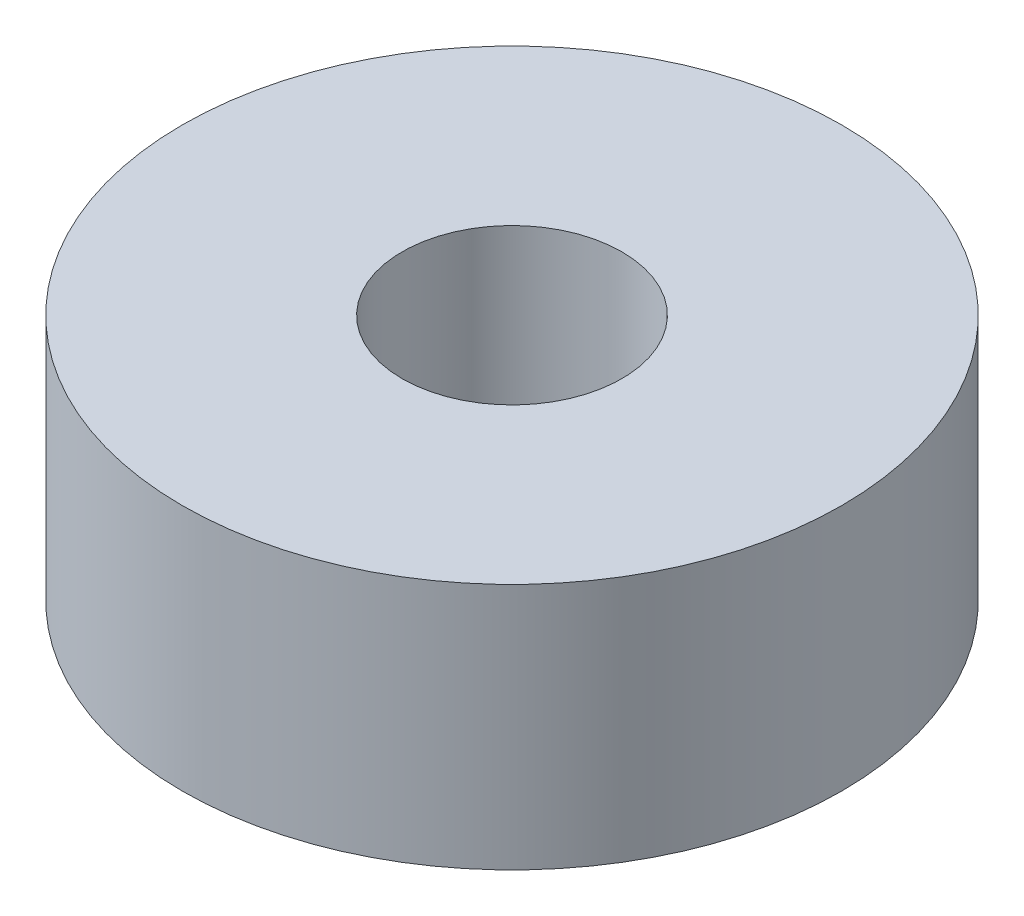
ISO-10303-21;
HEADER;
FILE_DESCRIPTION(('STEP AP214'),'2;1');
FILE_NAME('part.step','',(''),(''),'','','');
FILE_SCHEMA(('AUTOMOTIVE_DESIGN { 1 0 10303 214 1 1 1 1 }'));
ENDSEC;
DATA;
#1=APPLICATION_CONTEXT('core data for automotive mechanical design processes');
#2=APPLICATION_PROTOCOL_DEFINITION('international standard','automotive_design',2000,#1);
#3=PRODUCT_CONTEXT('',#1,'mechanical');
#4=PRODUCT('Part','Part','',(#3));
#5=PRODUCT_RELATED_PRODUCT_CATEGORY('part','',(#4));
#6=PRODUCT_DEFINITION_FORMATION('','',#4);
#7=PRODUCT_DEFINITION_CONTEXT('part definition',#1,'design');
#8=PRODUCT_DEFINITION('design','',#6,#7);
#9=PRODUCT_DEFINITION_SHAPE('','',#8);
#10=(LENGTH_UNIT() NAMED_UNIT(*) SI_UNIT(.MILLI.,.METRE.));
#11=(NAMED_UNIT(*) PLANE_ANGLE_UNIT() SI_UNIT($,.RADIAN.));
#12=(NAMED_UNIT(*) SI_UNIT($,.STERADIAN.) SOLID_ANGLE_UNIT());
#13=UNCERTAINTY_MEASURE_WITH_UNIT(LENGTH_MEASURE(1.E-05),#10,'distance_accuracy_value','');
#14=(GEOMETRIC_REPRESENTATION_CONTEXT(3) GLOBAL_UNCERTAINTY_ASSIGNED_CONTEXT((#13)) GLOBAL_UNIT_ASSIGNED_CONTEXT((#10,
#11,#12)) REPRESENTATION_CONTEXT('',''));
#15=CARTESIAN_POINT('',(0.,0.,0.));
#16=DIRECTION('',(0.,0.,1.));
#17=DIRECTION('',(1.,0.,0.));
#18=AXIS2_PLACEMENT_3D('',#15,#16,#17);
#19=CARTESIAN_POINT('',(0.,9.,0.));
#20=DIRECTION('',(0.,1.,0.));
#21=DIRECTION('',(0.,0.,1.));
#22=AXIS2_PLACEMENT_3D('',#19,#20,#21);
#23=PLANE('',#22);
#24=CARTESIAN_POINT('',(0.,9.,0.));
#25=DIRECTION('',(0.,1.,0.));
#26=DIRECTION('',(0.,0.,1.));
#27=AXIS2_PLACEMENT_3D('',#24,#25,#26);
#28=CIRCLE('',#27,12.);
#29=CARTESIAN_POINT('',(0.,9.,12.));
#30=VERTEX_POINT('',#29);
#31=EDGE_CURVE('E10',#30,#30,#28,.T.);
#32=ORIENTED_EDGE('',*,*,#31,.T.);
#33=EDGE_LOOP('',(#32));
#34=FACE_BOUND('',#33,.T.);
#35=CARTESIAN_POINT('',(0.,9.,0.));
#36=DIRECTION('',(0.,1.,0.));
#37=DIRECTION('',(0.,0.,1.));
#38=AXIS2_PLACEMENT_3D('',#35,#36,#37);
#39=CIRCLE('',#38,4.);
#40=CARTESIAN_POINT('',(0.,9.,4.));
#41=VERTEX_POINT('',#40);
#42=EDGE_CURVE('E41',#41,#41,#39,.T.);
#43=ORIENTED_EDGE('',*,*,#42,.F.);
#44=EDGE_LOOP('',(#43));
#45=FACE_BOUND('',#44,.T.);
#46=ADVANCED_FACE('F30',(#34,#45),#23,.T.);
#47=CARTESIAN_POINT('',(0.,0.,0.));
#48=DIRECTION('',(0.,1.,0.));
#49=DIRECTION('',(0.,0.,1.));
#50=AXIS2_PLACEMENT_3D('',#47,#48,#49);
#51=PLANE('',#50);
#52=CARTESIAN_POINT('',(0.,0.,0.));
#53=DIRECTION('',(0.,1.,0.));
#54=DIRECTION('',(0.,0.,1.));
#55=AXIS2_PLACEMENT_3D('',#52,#53,#54);
#56=CIRCLE('',#55,12.);
#57=CARTESIAN_POINT('',(0.,0.,12.));
#58=VERTEX_POINT('',#57);
#59=EDGE_CURVE('E34',#58,#58,#56,.T.);
#60=ORIENTED_EDGE('',*,*,#59,.F.);
#61=EDGE_LOOP('',(#60));
#62=FACE_BOUND('',#61,.T.);
#63=CARTESIAN_POINT('',(0.,0.,0.));
#64=DIRECTION('',(0.,1.,0.));
#65=DIRECTION('',(0.,0.,1.));
#66=AXIS2_PLACEMENT_3D('',#63,#64,#65);
#67=CIRCLE('',#66,4.);
#68=CARTESIAN_POINT('',(0.,0.,4.));
#69=VERTEX_POINT('',#68);
#70=EDGE_CURVE('E43',#69,#69,#67,.T.);
#71=ORIENTED_EDGE('',*,*,#70,.T.);
#72=EDGE_LOOP('',(#71));
#73=FACE_BOUND('',#72,.T.);
#74=ADVANCED_FACE('F53',(#62,#73),#51,.F.);
#75=CARTESIAN_POINT('',(0.,9.,0.));
#76=DIRECTION('',(0.,-1.,0.));
#77=DIRECTION('',(0.,0.,-1.));
#78=AXIS2_PLACEMENT_3D('',#75,#76,#77);
#79=CYLINDRICAL_SURFACE('',#78,12.);
#80=ORIENTED_EDGE('',*,*,#31,.F.);
#81=EDGE_LOOP('',(#80));
#82=FACE_BOUND('',#81,.T.);
#83=ORIENTED_EDGE('',*,*,#59,.T.);
#84=EDGE_LOOP('',(#83));
#85=FACE_BOUND('',#84,.T.);
#86=ADVANCED_FACE('F32',(#82,#85),#79,.T.);
#87=CARTESIAN_POINT('',(0.,9.,0.));
#88=DIRECTION('',(0.,-1.,0.));
#89=DIRECTION('',(0.,0.,-1.));
#90=AXIS2_PLACEMENT_3D('',#87,#88,#89);
#91=CYLINDRICAL_SURFACE('',#90,4.);
#92=ORIENTED_EDGE('',*,*,#42,.T.);
#93=EDGE_LOOP('',(#92));
#94=FACE_BOUND('',#93,.T.);
#95=ORIENTED_EDGE('',*,*,#70,.F.);
#96=EDGE_LOOP('',(#95));
#97=FACE_BOUND('',#96,.T.);
#98=ADVANCED_FACE('F49',(#94,#97),#91,.F.);
#99=CLOSED_SHELL('',(#46,#74,#86,#98));
#100=MANIFOLD_SOLID_BREP('B2',#99);
#101=ADVANCED_BREP_SHAPE_REPRESENTATION('',(#18,#100),#14);
#102=SHAPE_DEFINITION_REPRESENTATION(#9,#101);
ENDSEC;
END-ISO-10303-21;
